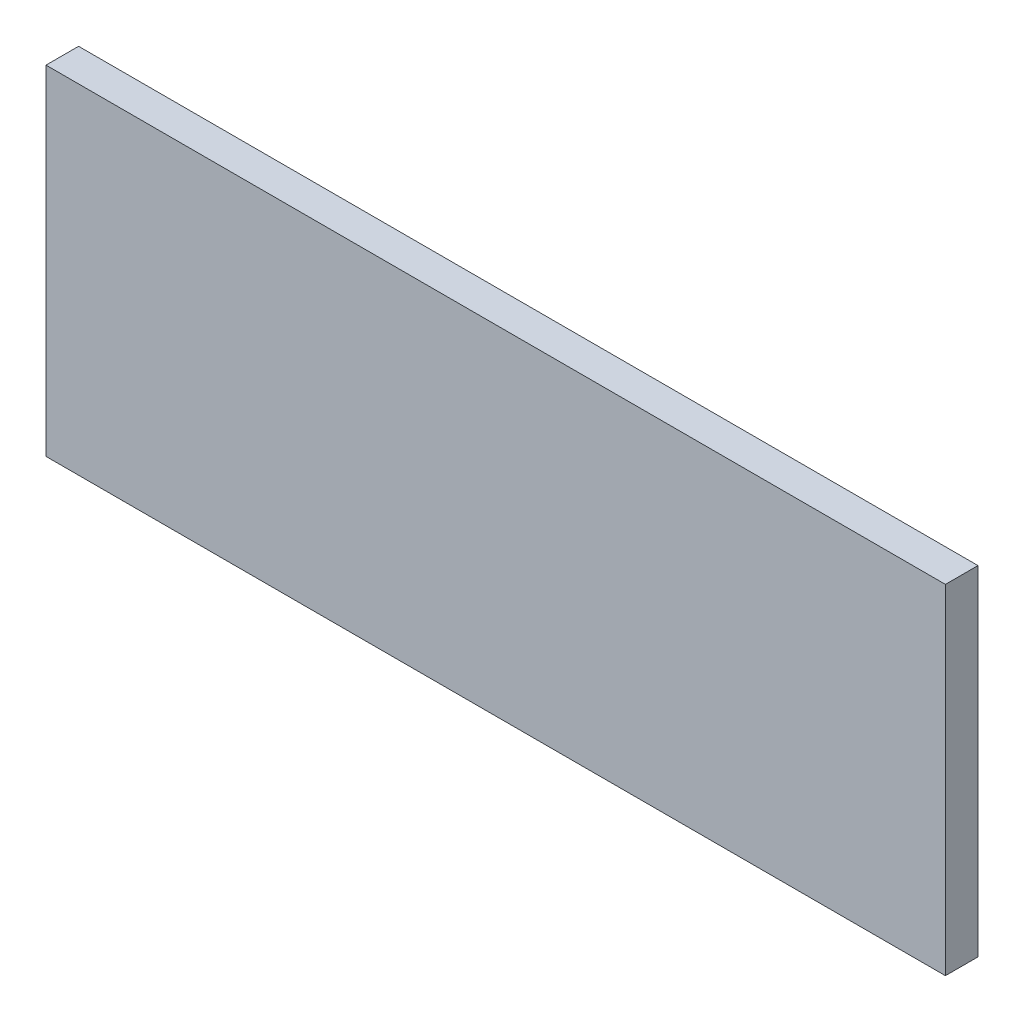
ISO-10303-21;
HEADER;
FILE_DESCRIPTION(('STEP AP214'),'2;1');
FILE_NAME('part.step','',(''),(''),'','','');
FILE_SCHEMA(('AUTOMOTIVE_DESIGN { 1 0 10303 214 1 1 1 1 }'));
ENDSEC;
DATA;
#1=APPLICATION_CONTEXT('core data for automotive mechanical design processes');
#2=APPLICATION_PROTOCOL_DEFINITION('international standard','automotive_design',2000,#1);
#3=PRODUCT_CONTEXT('',#1,'mechanical');
#4=PRODUCT('Part','Part','',(#3));
#5=PRODUCT_RELATED_PRODUCT_CATEGORY('part','',(#4));
#6=PRODUCT_DEFINITION_FORMATION('','',#4);
#7=PRODUCT_DEFINITION_CONTEXT('part definition',#1,'design');
#8=PRODUCT_DEFINITION('design','',#6,#7);
#9=PRODUCT_DEFINITION_SHAPE('','',#8);
#10=(LENGTH_UNIT() NAMED_UNIT(*) SI_UNIT(.MILLI.,.METRE.));
#11=(NAMED_UNIT(*) PLANE_ANGLE_UNIT() SI_UNIT($,.RADIAN.));
#12=(NAMED_UNIT(*) SI_UNIT($,.STERADIAN.) SOLID_ANGLE_UNIT());
#13=UNCERTAINTY_MEASURE_WITH_UNIT(LENGTH_MEASURE(1.E-05),#10,'distance_accuracy_value','');
#14=(GEOMETRIC_REPRESENTATION_CONTEXT(3) GLOBAL_UNCERTAINTY_ASSIGNED_CONTEXT((#13)) GLOBAL_UNIT_ASSIGNED_CONTEXT((#10,
#11,#12)) REPRESENTATION_CONTEXT('',''));
#15=CARTESIAN_POINT('',(0.,0.,0.));
#16=DIRECTION('',(0.,0.,1.));
#17=DIRECTION('',(1.,0.,0.));
#18=AXIS2_PLACEMENT_3D('',#15,#16,#17);
#19=CARTESIAN_POINT('',(138.,-52.,5.));
#20=DIRECTION('',(-1.,0.,0.));
#21=DIRECTION('',(0.,0.,1.));
#22=AXIS2_PLACEMENT_3D('',#19,#20,#21);
#23=PLANE('',#22);
#24=DIRECTION('',(0.,1.,0.));
#25=VECTOR('',#24,1.);
#26=CARTESIAN_POINT('',(138.,-52.,-5.));
#27=LINE('',#26,#25);
#28=CARTESIAN_POINT('',(138.,-52.,-5.));
#29=VERTEX_POINT('',#28);
#30=CARTESIAN_POINT('',(138.,52.,-5.));
#31=VERTEX_POINT('',#30);
#32=EDGE_CURVE('E98',#29,#31,#27,.T.);
#33=ORIENTED_EDGE('',*,*,#32,.T.);
#34=DIRECTION('',(0.,0.,-1.));
#35=VECTOR('',#34,1.);
#36=CARTESIAN_POINT('',(138.,52.,5.));
#37=LINE('',#36,#35);
#38=CARTESIAN_POINT('',(138.,52.,5.));
#39=VERTEX_POINT('',#38);
#40=EDGE_CURVE('E11',#39,#31,#37,.T.);
#41=ORIENTED_EDGE('',*,*,#40,.F.);
#42=DIRECTION('',(0.,1.,0.));
#43=VECTOR('',#42,1.);
#44=CARTESIAN_POINT('',(138.,-52.,5.));
#45=LINE('',#44,#43);
#46=CARTESIAN_POINT('',(138.,-52.,5.));
#47=VERTEX_POINT('',#46);
#48=EDGE_CURVE('E86',#47,#39,#45,.T.);
#49=ORIENTED_EDGE('',*,*,#48,.F.);
#50=DIRECTION('',(0.,0.,-1.));
#51=VECTOR('',#50,1.);
#52=CARTESIAN_POINT('',(138.,-52.,5.));
#53=LINE('',#52,#51);
#54=EDGE_CURVE('E94',#47,#29,#53,.T.);
#55=ORIENTED_EDGE('',*,*,#54,.T.);
#56=EDGE_LOOP('',(#33,#41,#49,#55));
#57=FACE_BOUND('',#56,.T.);
#58=ADVANCED_FACE('F35',(#57),#23,.F.);
#59=CARTESIAN_POINT('',(-138.,52.,5.));
#60=DIRECTION('',(0.,-1.,0.));
#61=DIRECTION('',(0.,0.,-1.));
#62=AXIS2_PLACEMENT_3D('',#59,#60,#61);
#63=PLANE('',#62);
#64=DIRECTION('',(-1.,0.,0.));
#65=VECTOR('',#64,1.);
#66=CARTESIAN_POINT('',(-138.,52.,-5.));
#67=LINE('',#66,#65);
#68=CARTESIAN_POINT('',(-138.,52.,-5.));
#69=VERTEX_POINT('',#68);
#70=EDGE_CURVE('E90',#31,#69,#67,.T.);
#71=ORIENTED_EDGE('',*,*,#70,.T.);
#72=DIRECTION('',(0.,0.,-1.));
#73=VECTOR('',#72,1.);
#74=CARTESIAN_POINT('',(-138.,52.,5.));
#75=LINE('',#74,#73);
#76=CARTESIAN_POINT('',(-138.,52.,5.));
#77=VERTEX_POINT('',#76);
#78=EDGE_CURVE('E43',#77,#69,#75,.T.);
#79=ORIENTED_EDGE('',*,*,#78,.F.);
#80=DIRECTION('',(-1.,0.,0.));
#81=VECTOR('',#80,1.);
#82=CARTESIAN_POINT('',(-138.,52.,5.));
#83=LINE('',#82,#81);
#84=EDGE_CURVE('E81',#39,#77,#83,.T.);
#85=ORIENTED_EDGE('',*,*,#84,.F.);
#86=ORIENTED_EDGE('',*,*,#40,.T.);
#87=EDGE_LOOP('',(#71,#79,#85,#86));
#88=FACE_BOUND('',#87,.T.);
#89=ADVANCED_FACE('F89',(#88),#63,.F.);
#90=CARTESIAN_POINT('',(-138.,-52.,5.));
#91=DIRECTION('',(1.,0.,0.));
#92=DIRECTION('',(0.,0.,-1.));
#93=AXIS2_PLACEMENT_3D('',#90,#91,#92);
#94=PLANE('',#93);
#95=DIRECTION('',(0.,-1.,0.));
#96=VECTOR('',#95,1.);
#97=CARTESIAN_POINT('',(-138.,-52.,-5.));
#98=LINE('',#97,#96);
#99=CARTESIAN_POINT('',(-138.,-52.,-5.));
#100=VERTEX_POINT('',#99);
#101=EDGE_CURVE('E68',#69,#100,#98,.T.);
#102=ORIENTED_EDGE('',*,*,#101,.T.);
#103=DIRECTION('',(0.,0.,-1.));
#104=VECTOR('',#103,1.);
#105=CARTESIAN_POINT('',(-138.,-52.,5.));
#106=LINE('',#105,#104);
#107=CARTESIAN_POINT('',(-138.,-52.,5.));
#108=VERTEX_POINT('',#107);
#109=EDGE_CURVE('E91',#108,#100,#106,.T.);
#110=ORIENTED_EDGE('',*,*,#109,.F.);
#111=DIRECTION('',(0.,-1.,0.));
#112=VECTOR('',#111,1.);
#113=CARTESIAN_POINT('',(-138.,-52.,5.));
#114=LINE('',#113,#112);
#115=EDGE_CURVE('E84',#77,#108,#114,.T.);
#116=ORIENTED_EDGE('',*,*,#115,.F.);
#117=ORIENTED_EDGE('',*,*,#78,.T.);
#118=EDGE_LOOP('',(#102,#110,#116,#117));
#119=FACE_BOUND('',#118,.T.);
#120=ADVANCED_FACE('F92',(#119),#94,.F.);
#121=CARTESIAN_POINT('',(-138.,-52.,5.));
#122=DIRECTION('',(0.,1.,0.));
#123=DIRECTION('',(0.,0.,1.));
#124=AXIS2_PLACEMENT_3D('',#121,#122,#123);
#125=PLANE('',#124);
#126=DIRECTION('',(1.,0.,0.));
#127=VECTOR('',#126,1.);
#128=CARTESIAN_POINT('',(-138.,-52.,-5.));
#129=LINE('',#128,#127);
#130=EDGE_CURVE('E74',#100,#29,#129,.T.);
#131=ORIENTED_EDGE('',*,*,#130,.T.);
#132=ORIENTED_EDGE('',*,*,#54,.F.);
#133=DIRECTION('',(1.,0.,0.));
#134=VECTOR('',#133,1.);
#135=CARTESIAN_POINT('',(-138.,-52.,5.));
#136=LINE('',#135,#134);
#137=EDGE_CURVE('E51',#108,#47,#136,.T.);
#138=ORIENTED_EDGE('',*,*,#137,.F.);
#139=ORIENTED_EDGE('',*,*,#109,.T.);
#140=EDGE_LOOP('',(#131,#132,#138,#139));
#141=FACE_BOUND('',#140,.T.);
#142=ADVANCED_FACE('F105',(#141),#125,.F.);
#143=CARTESIAN_POINT('',(0.,0.,5.));
#144=DIRECTION('',(0.,0.,-1.));
#145=DIRECTION('',(-1.,0.,0.));
#146=AXIS2_PLACEMENT_3D('',#143,#144,#145);
#147=PLANE('',#146);
#148=ORIENTED_EDGE('',*,*,#48,.T.);
#149=ORIENTED_EDGE('',*,*,#84,.T.);
#150=ORIENTED_EDGE('',*,*,#115,.T.);
#151=ORIENTED_EDGE('',*,*,#137,.T.);
#152=EDGE_LOOP('',(#148,#149,#150,#151));
#153=FACE_BOUND('',#152,.T.);
#154=ADVANCED_FACE('F82',(#153),#147,.F.);
#155=CARTESIAN_POINT('',(0.,0.,-5.));
#156=DIRECTION('',(0.,0.,-1.));
#157=DIRECTION('',(-1.,0.,0.));
#158=AXIS2_PLACEMENT_3D('',#155,#156,#157);
#159=PLANE('',#158);
#160=ORIENTED_EDGE('',*,*,#32,.F.);
#161=ORIENTED_EDGE('',*,*,#130,.F.);
#162=ORIENTED_EDGE('',*,*,#101,.F.);
#163=ORIENTED_EDGE('',*,*,#70,.F.);
#164=EDGE_LOOP('',(#160,#161,#162,#163));
#165=FACE_BOUND('',#164,.T.);
#166=ADVANCED_FACE('F108',(#165),#159,.T.);
#167=CLOSED_SHELL('',(#58,#89,#120,#142,#154,#166));
#168=MANIFOLD_SOLID_BREP('B2',#167);
#169=ADVANCED_BREP_SHAPE_REPRESENTATION('',(#18,#168),#14);
#170=SHAPE_DEFINITION_REPRESENTATION(#9,#169);
ENDSEC;
END-ISO-10303-21;
